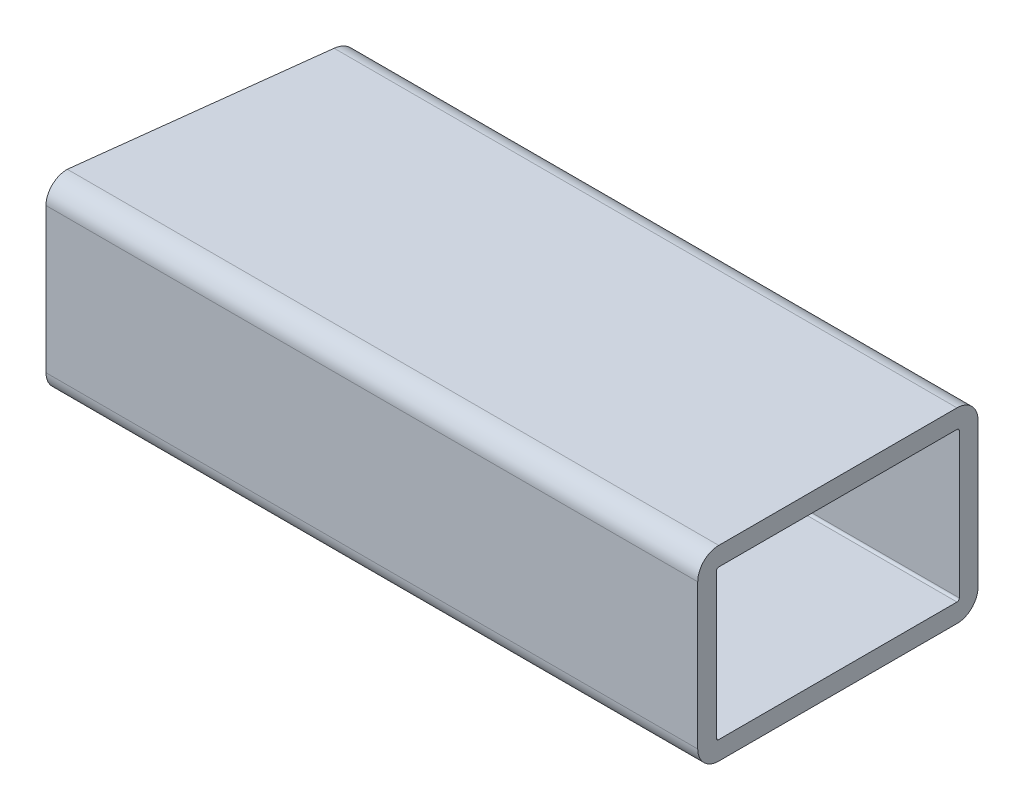
ISO-10303-21;
HEADER;
FILE_DESCRIPTION(('STEP AP214'),'2;1');
FILE_NAME('part.step','',(''),(''),'','','');
FILE_SCHEMA(('AUTOMOTIVE_DESIGN { 1 0 10303 214 1 1 1 1 }'));
ENDSEC;
DATA;
#1=APPLICATION_CONTEXT('core data for automotive mechanical design processes');
#2=APPLICATION_PROTOCOL_DEFINITION('international standard','automotive_design',2000,#1);
#3=PRODUCT_CONTEXT('',#1,'mechanical');
#4=PRODUCT('Part','Part','',(#3));
#5=PRODUCT_RELATED_PRODUCT_CATEGORY('part','',(#4));
#6=PRODUCT_DEFINITION_FORMATION('','',#4);
#7=PRODUCT_DEFINITION_CONTEXT('part definition',#1,'design');
#8=PRODUCT_DEFINITION('design','',#6,#7);
#9=PRODUCT_DEFINITION_SHAPE('','',#8);
#10=(LENGTH_UNIT() NAMED_UNIT(*) SI_UNIT(.MILLI.,.METRE.));
#11=(NAMED_UNIT(*) PLANE_ANGLE_UNIT() SI_UNIT($,.RADIAN.));
#12=(NAMED_UNIT(*) SI_UNIT($,.STERADIAN.) SOLID_ANGLE_UNIT());
#13=UNCERTAINTY_MEASURE_WITH_UNIT(LENGTH_MEASURE(1.E-05),#10,'distance_accuracy_value','');
#14=(GEOMETRIC_REPRESENTATION_CONTEXT(3) GLOBAL_UNCERTAINTY_ASSIGNED_CONTEXT((#13)) GLOBAL_UNIT_ASSIGNED_CONTEXT((#10,
#11,#12)) REPRESENTATION_CONTEXT('',''));
#15=CARTESIAN_POINT('',(0.,0.,0.));
#16=DIRECTION('',(0.,0.,1.));
#17=DIRECTION('',(1.,0.,0.));
#18=AXIS2_PLACEMENT_3D('',#15,#16,#17);
#19=CARTESIAN_POINT('',(0.479999999999985,15.5,26.));
#20=CARTESIAN_POINT('',(0.479999999999998,15.5,27.3333333333333));
#21=CARTESIAN_POINT('',(0.48000000000001,15.5,28.6666666666667));
#22=CARTESIAN_POINT('',(0.480000000000022,15.5,30.));
#23=CARTESIAN_POINT('',(0.479999999999985,14.5,26.));
#24=CARTESIAN_POINT('',(0.479999999999998,11.8333333333333,27.3333333333333));
#25=CARTESIAN_POINT('',(0.48000000000001,9.16666666666668,28.6666666666667));
#26=CARTESIAN_POINT('',(0.480000000000022,6.50000000000001,30.));
#27=CARTESIAN_POINT('',(0.599999999999985,14.5,25.));
#28=CARTESIAN_POINT('',(0.599999999999973,11.8333333333333,23.6666666666667));
#29=CARTESIAN_POINT('',(0.59999999999996,9.16666666666668,22.3333333333333));
#30=CARTESIAN_POINT('',(0.599999999999947,6.50000000000001,21.));
#31=CARTESIAN_POINT('',(0.599999999999985,15.5,25.));
#32=CARTESIAN_POINT('',(0.599999999999972,15.5,23.6666666666667));
#33=CARTESIAN_POINT('',(0.59999999999996,15.5,22.3333333333333));
#34=CARTESIAN_POINT('',(0.599999999999947,15.5,21.));
#35=CARTESIAN_POINT('',(0.599999999999985,16.5,25.));
#36=CARTESIAN_POINT('',(0.599999999999973,19.1666666666667,23.6666666666667));
#37=CARTESIAN_POINT('',(0.59999999999996,21.8333333333333,22.3333333333333));
#38=CARTESIAN_POINT('',(0.599999999999947,24.5,21.));
#39=CARTESIAN_POINT('',(0.479999999999985,16.5,26.));
#40=CARTESIAN_POINT('',(0.479999999999998,19.1666666666667,27.3333333333333));
#41=CARTESIAN_POINT('',(0.48000000000001,21.8333333333333,28.6666666666667));
#42=CARTESIAN_POINT('',(0.480000000000022,24.5,30.));
#43=CARTESIAN_POINT('',(0.479999999999985,15.5,26.));
#44=CARTESIAN_POINT('',(0.479999999999998,15.5,27.3333333333333));
#45=CARTESIAN_POINT('',(0.48000000000001,15.5,28.6666666666667));
#46=CARTESIAN_POINT('',(0.480000000000022,15.5,30.));
#47=(BOUNDED_SURFACE() B_SPLINE_SURFACE(3,3,((#19,#20,#21,#22),(#23,#24,#25,#26),(#27,#28,#29,
#30),(#31,#32,#33,#34),(#35,#36,#37,#38),(#39,#40,#41,#42),(#43,#44,#45,#46)),.UNSPECIFIED.,.T.,
.F.,.F.) B_SPLINE_SURFACE_WITH_KNOTS((4,3,4),(4,4),(0.,0.5,1.),(0.,1.),
.UNSPECIFIED.) GEOMETRIC_REPRESENTATION_ITEM() RATIONAL_B_SPLINE_SURFACE(((1.,1.,1.,1.),
(0.333333333333333,0.333333333333333,0.333333333333333,0.333333333333333),(0.333333333333333,
0.333333333333333,0.333333333333333,0.333333333333333),(1.,1.,1.,1.),(0.333333333333333,
0.333333333333333,0.333333333333333,0.333333333333333),(0.333333333333333,0.333333333333333,
0.333333333333333,0.333333333333333),(1.,1.,1.,1.))) REPRESENTATION_ITEM('') SURFACE());
#48=DIRECTION('',(0.,0.,-1.));
#49=VECTOR('',#48,1.);
#50=CARTESIAN_POINT('',(0.47999999999998,15.5,26.));
#51=LINE('',#50,#49);
#52=CARTESIAN_POINT('',(0.47999999999998,15.5,30.));
#53=VERTEX_POINT('',#52);
#54=CARTESIAN_POINT('',(0.47999999999998,15.5,26.));
#55=VERTEX_POINT('',#54);
#56=EDGE_CURVE('E12',#53,#55,#51,.T.);
#57=CARTESIAN_POINT('',(0.539999999999985,15.5,25.5));
#58=DIRECTION('',(0.999911122961208,0.,0.0133321483061411));
#59=DIRECTION('',(-0.0133321483061411,0.,0.999911122961208));
#60=AXIS2_PLACEMENT_3D('',#57,#58,#59);
#61=ELLIPSE('',#60,4.5003999822238,4.5);
#62=CARTESIAN_POINT('',(0.539999999999985,20.,25.5));
#63=VERTEX_POINT('',#62);
#64=EDGE_CURVE('E310',#63,#53,#61,.T.);
#65=DIRECTION('',(0.,-1.,0.));
#66=VECTOR('',#65,1.);
#67=CARTESIAN_POINT('',(0.53999999999999,16.,25.5));
#68=LINE('',#67,#66);
#69=CARTESIAN_POINT('',(0.53999999999999,16.,25.5));
#70=VERTEX_POINT('',#69);
#71=EDGE_CURVE('E84',#63,#70,#68,.T.);
#72=CARTESIAN_POINT('',(0.539999999999985,15.5,25.5));
#73=DIRECTION('',(0.992876838486922,0.,0.119145220618431));
#74=DIRECTION('',(-0.119145220618431,0.,0.992876838486922));
#75=AXIS2_PLACEMENT_3D('',#72,#73,#74);
#76=ELLIPSE('',#75,0.503587132480565,0.499999999999998);
#77=EDGE_CURVE('E265',#70,#55,#76,.T.);
#78=ORIENTED_EDGE('',*,*,#56,.F.);
#79=ORIENTED_EDGE('',*,*,#64,.F.);
#80=ORIENTED_EDGE('',*,*,#71,.T.);
#81=ORIENTED_EDGE('',*,*,#77,.T.);
#82=EDGE_LOOP('',(#78,#79,#80,#81));
#83=FACE_BOUND('',#82,.T.);
#84=ADVANCED_FACE('F75',(#83),#47,.T.);
#85=CARTESIAN_POINT('',(2.51971608832807,16.,9.00236593059934));
#86=DIRECTION('',(0.992876838486922,0.,0.119145220618431));
#87=DIRECTION('',(-0.119145220618431,0.,0.992876838486922));
#88=AXIS2_PLACEMENT_3D('',#85,#86,#87);
#89=PLANE('',#88);
#90=ORIENTED_EDGE('',*,*,#71,.F.);
#91=DIRECTION('',(-0.119145220618431,0.,0.992876838486922));
#92=VECTOR('',#91,1.);
#93=CARTESIAN_POINT('',(2.51971608832807,20.,9.00236593059934));
#94=LINE('',#93,#92);
#95=CARTESIAN_POINT('',(6.66,20.,-25.5));
#96=VERTEX_POINT('',#95);
#97=EDGE_CURVE('E315',#96,#63,#94,.T.);
#98=ORIENTED_EDGE('',*,*,#97,.F.);
#99=DIRECTION('',(0.,1.,0.));
#100=VECTOR('',#99,1.);
#101=CARTESIAN_POINT('',(6.66000000000001,20.,-25.5));
#102=LINE('',#101,#100);
#103=CARTESIAN_POINT('',(6.66,16.,-25.5));
#104=VERTEX_POINT('',#103);
#105=EDGE_CURVE('E229',#104,#96,#102,.T.);
#106=ORIENTED_EDGE('',*,*,#105,.F.);
#107=DIRECTION('',(-0.119145220618431,0.,0.992876838486922));
#108=VECTOR('',#107,1.);
#109=CARTESIAN_POINT('',(2.51971608832807,16.,9.00236593059934));
#110=LINE('',#109,#108);
#111=EDGE_CURVE('E273',#104,#70,#110,.T.);
#112=ORIENTED_EDGE('',*,*,#111,.T.);
#113=EDGE_LOOP('',(#90,#98,#106,#112));
#114=FACE_BOUND('',#113,.T.);
#115=ADVANCED_FACE('F355',(#114),#89,.F.);
#116=CARTESIAN_POINT('',(8.55283911671925,-16.,-41.2736593059937));
#117=DIRECTION('',(0.992876838486922,0.,0.119145220618431));
#118=DIRECTION('',(0.119145220618431,0.,-0.992876838486922));
#119=AXIS2_PLACEMENT_3D('',#116,#117,#118);
#120=PLANE('',#119);
#121=DIRECTION('',(0.,-1.,0.));
#122=VECTOR('',#121,1.);
#123=CARTESIAN_POINT('',(6.66,-20.,-25.5));
#124=LINE('',#123,#122);
#125=CARTESIAN_POINT('',(6.66,-16.,-25.5));
#126=VERTEX_POINT('',#125);
#127=CARTESIAN_POINT('',(6.66,-20.,-25.5));
#128=VERTEX_POINT('',#127);
#129=EDGE_CURVE('E215',#126,#128,#124,.T.);
#130=ORIENTED_EDGE('',*,*,#129,.T.);
#131=DIRECTION('',(0.119145220618431,0.,-0.992876838486922));
#132=VECTOR('',#131,1.);
#133=CARTESIAN_POINT('',(8.55283911671925,-20.,-41.2736593059937));
#134=LINE('',#133,#132);
#135=CARTESIAN_POINT('',(0.540000000000013,-20.,25.5));
#136=VERTEX_POINT('',#135);
#137=EDGE_CURVE('E191',#136,#128,#134,.T.);
#138=ORIENTED_EDGE('',*,*,#137,.F.);
#139=DIRECTION('',(0.,1.,0.));
#140=VECTOR('',#139,1.);
#141=CARTESIAN_POINT('',(0.540000000000002,-16.,25.5));
#142=LINE('',#141,#140);
#143=CARTESIAN_POINT('',(0.540000000000002,-16.,25.5));
#144=VERTEX_POINT('',#143);
#145=EDGE_CURVE('E343',#136,#144,#142,.T.);
#146=ORIENTED_EDGE('',*,*,#145,.T.);
#147=DIRECTION('',(0.119145220618431,0.,-0.992876838486922));
#148=VECTOR('',#147,1.);
#149=CARTESIAN_POINT('',(8.55283911671925,-16.,-41.2736593059937));
#150=LINE('',#149,#148);
#151=EDGE_CURVE('E218',#144,#126,#150,.T.);
#152=ORIENTED_EDGE('',*,*,#151,.T.);
#153=EDGE_LOOP('',(#130,#138,#146,#152));
#154=FACE_BOUND('',#153,.T.);
#155=ADVANCED_FACE('F216',(#154),#120,.F.);
#156=CARTESIAN_POINT('',(0.479999999999985,-15.5,26.));
#157=CARTESIAN_POINT('',(0.479999999999998,-15.5,27.3333333333333));
#158=CARTESIAN_POINT('',(0.48000000000001,-15.5,28.6666666666667));
#159=CARTESIAN_POINT('',(0.480000000000022,-15.5,30.));
#160=CARTESIAN_POINT('',(0.479999999999985,-16.5,26.));
#161=CARTESIAN_POINT('',(0.479999999999998,-19.1666666666667,27.3333333333333));
#162=CARTESIAN_POINT('',(0.48000000000001,-21.8333333333333,28.6666666666667));
#163=CARTESIAN_POINT('',(0.480000000000022,-24.5,30.));
#164=CARTESIAN_POINT('',(0.599999999999985,-16.5,25.));
#165=CARTESIAN_POINT('',(0.599999999999973,-19.1666666666667,23.6666666666667));
#166=CARTESIAN_POINT('',(0.59999999999996,-21.8333333333333,22.3333333333333));
#167=CARTESIAN_POINT('',(0.599999999999947,-24.5,21.));
#168=CARTESIAN_POINT('',(0.599999999999985,-15.5,25.));
#169=CARTESIAN_POINT('',(0.599999999999972,-15.5,23.6666666666667));
#170=CARTESIAN_POINT('',(0.59999999999996,-15.5,22.3333333333333));
#171=CARTESIAN_POINT('',(0.599999999999947,-15.5,21.));
#172=CARTESIAN_POINT('',(0.599999999999985,-14.5,25.));
#173=CARTESIAN_POINT('',(0.599999999999973,-11.8333333333333,23.6666666666667));
#174=CARTESIAN_POINT('',(0.59999999999996,-9.16666666666668,22.3333333333333));
#175=CARTESIAN_POINT('',(0.599999999999947,-6.50000000000001,21.));
#176=CARTESIAN_POINT('',(0.479999999999985,-14.5,26.));
#177=CARTESIAN_POINT('',(0.479999999999998,-11.8333333333333,27.3333333333333));
#178=CARTESIAN_POINT('',(0.48000000000001,-9.16666666666668,28.6666666666667));
#179=CARTESIAN_POINT('',(0.480000000000022,-6.50000000000001,30.));
#180=CARTESIAN_POINT('',(0.479999999999985,-15.5,26.));
#181=CARTESIAN_POINT('',(0.479999999999998,-15.5,27.3333333333333));
#182=CARTESIAN_POINT('',(0.48000000000001,-15.5,28.6666666666667));
#183=CARTESIAN_POINT('',(0.480000000000022,-15.5,30.));
#184=(BOUNDED_SURFACE() B_SPLINE_SURFACE(3,3,((#156,#157,#158,#159),(#160,#161,#162,#163),(#164,
#165,#166,#167),(#168,#169,#170,#171),(#172,#173,#174,#175),(#176,#177,#178,#179),(#180,#181,
#182,#183)),.UNSPECIFIED.,.T.,.F.,.F.) B_SPLINE_SURFACE_WITH_KNOTS((4,3,4),(4,4),(0.,0.5,1.),
(0.,1.),.UNSPECIFIED.) GEOMETRIC_REPRESENTATION_ITEM() RATIONAL_B_SPLINE_SURFACE(((1.,1.,1.,1.),
(0.333333333333333,0.333333333333333,0.333333333333333,0.333333333333333),(0.333333333333333,
0.333333333333333,0.333333333333333,0.333333333333333),(1.,1.,1.,1.),(0.333333333333333,
0.333333333333333,0.333333333333333,0.333333333333333),(0.333333333333333,0.333333333333333,
0.333333333333333,0.333333333333333),(1.,1.,1.,1.))) REPRESENTATION_ITEM('') SURFACE());
#185=CARTESIAN_POINT('',(0.539999999999985,-15.5,25.5));
#186=DIRECTION('',(0.999911122961208,0.,0.0133321483061411));
#187=DIRECTION('',(-0.0133321483061411,0.,0.999911122961208));
#188=AXIS2_PLACEMENT_3D('',#185,#186,#187);
#189=ELLIPSE('',#188,4.5003999822238,4.5);
#190=CARTESIAN_POINT('',(0.480000000000008,-15.5,30.));
#191=VERTEX_POINT('',#190);
#192=EDGE_CURVE('E222',#191,#136,#189,.T.);
#193=DIRECTION('',(0.,0.,-1.));
#194=VECTOR('',#193,1.);
#195=CARTESIAN_POINT('',(0.480000000000008,-15.5,26.));
#196=LINE('',#195,#194);
#197=CARTESIAN_POINT('',(0.480000000000008,-15.5,26.));
#198=VERTEX_POINT('',#197);
#199=EDGE_CURVE('E79',#191,#198,#196,.T.);
#200=CARTESIAN_POINT('',(0.539999999999985,-15.5,25.5));
#201=DIRECTION('',(0.992876838486922,0.,0.119145220618431));
#202=DIRECTION('',(-0.119145220618431,0.,0.992876838486922));
#203=AXIS2_PLACEMENT_3D('',#200,#201,#202);
#204=ELLIPSE('',#203,0.503587132480565,0.499999999999998);
#205=EDGE_CURVE('E246',#198,#144,#204,.T.);
#206=ORIENTED_EDGE('',*,*,#145,.F.);
#207=ORIENTED_EDGE('',*,*,#192,.F.);
#208=ORIENTED_EDGE('',*,*,#199,.T.);
#209=ORIENTED_EDGE('',*,*,#205,.T.);
#210=EDGE_LOOP('',(#206,#207,#208,#209));
#211=FACE_BOUND('',#210,.T.);
#212=ADVANCED_FACE('F419',(#211),#184,.T.);
#213=CARTESIAN_POINT('',(0.480000000000008,15.5,26.));
#214=DIRECTION('',(1.,0.,0.));
#215=DIRECTION('',(0.,-1.,0.));
#216=AXIS2_PLACEMENT_3D('',#213,#214,#215);
#217=PLANE('',#216);
#218=DIRECTION('',(0.,1.,0.));
#219=VECTOR('',#218,1.);
#220=CARTESIAN_POINT('',(0.47999999999998,15.5,30.));
#221=LINE('',#220,#219);
#222=EDGE_CURVE('E301',#53,#191,#221,.F.);
#223=ORIENTED_EDGE('',*,*,#222,.F.);
#224=ORIENTED_EDGE('',*,*,#56,.T.);
#225=DIRECTION('',(0.,-1.,0.));
#226=VECTOR('',#225,1.);
#227=CARTESIAN_POINT('',(0.480000000000008,15.5,26.));
#228=LINE('',#227,#226);
#229=EDGE_CURVE('E257',#55,#198,#228,.T.);
#230=ORIENTED_EDGE('',*,*,#229,.T.);
#231=ORIENTED_EDGE('',*,*,#199,.F.);
#232=EDGE_LOOP('',(#223,#224,#230,#231));
#233=FACE_BOUND('',#232,.T.);
#234=ADVANCED_FACE('F373',(#233),#217,.F.);
#235=CARTESIAN_POINT('',(140.,-16.,-25.5));
#236=DIRECTION('',(1.,0.,0.));
#237=DIRECTION('',(0.,0.,-1.));
#238=AXIS2_PLACEMENT_3D('',#235,#236,#237);
#239=PLANE('',#238);
#240=DIRECTION('',(0.,0.,-1.));
#241=VECTOR('',#240,1.);
#242=CARTESIAN_POINT('',(140.,-16.,-25.5));
#243=LINE('',#242,#241);
#244=CARTESIAN_POINT('',(140.,-16.,25.5));
#245=VERTEX_POINT('',#244);
#246=CARTESIAN_POINT('',(140.,-16.,-25.5));
#247=VERTEX_POINT('',#246);
#248=EDGE_CURVE('E293',#245,#247,#243,.T.);
#249=ORIENTED_EDGE('',*,*,#248,.F.);
#250=CARTESIAN_POINT('',(140.,-15.5,25.5));
#251=DIRECTION('',(1.,0.,0.));
#252=DIRECTION('',(0.,0.,-1.));
#253=AXIS2_PLACEMENT_3D('',#250,#251,#252);
#254=CIRCLE('',#253,0.499999999999998);
#255=CARTESIAN_POINT('',(140.,-15.5,26.));
#256=VERTEX_POINT('',#255);
#257=EDGE_CURVE('E252',#256,#245,#254,.T.);
#258=ORIENTED_EDGE('',*,*,#257,.F.);
#259=DIRECTION('',(0.,-1.,0.));
#260=VECTOR('',#259,1.);
#261=CARTESIAN_POINT('',(140.,15.5,26.));
#262=LINE('',#261,#260);
#263=CARTESIAN_POINT('',(140.,15.5,26.));
#264=VERTEX_POINT('',#263);
#265=EDGE_CURVE('E263',#264,#256,#262,.T.);
#266=ORIENTED_EDGE('',*,*,#265,.F.);
#267=CARTESIAN_POINT('',(140.,15.5,25.5));
#268=DIRECTION('',(1.,0.,0.));
#269=DIRECTION('',(0.,0.,-1.));
#270=AXIS2_PLACEMENT_3D('',#267,#268,#269);
#271=CIRCLE('',#270,0.499999999999998);
#272=CARTESIAN_POINT('',(140.,16.,25.5));
#273=VERTEX_POINT('',#272);
#274=EDGE_CURVE('E271',#273,#264,#271,.T.);
#275=ORIENTED_EDGE('',*,*,#274,.F.);
#276=DIRECTION('',(0.,0.,1.));
#277=VECTOR('',#276,1.);
#278=CARTESIAN_POINT('',(140.,16.,25.5));
#279=LINE('',#278,#277);
#280=CARTESIAN_POINT('',(140.,16.,-25.5));
#281=VERTEX_POINT('',#280);
#282=EDGE_CURVE('E278',#281,#273,#279,.T.);
#283=ORIENTED_EDGE('',*,*,#282,.F.);
#284=CARTESIAN_POINT('',(140.,15.5,-25.5));
#285=DIRECTION('',(1.,0.,0.));
#286=DIRECTION('',(0.,0.,-1.));
#287=AXIS2_PLACEMENT_3D('',#284,#285,#286);
#288=CIRCLE('',#287,0.499999999999998);
#289=CARTESIAN_POINT('',(140.,15.5,-26.));
#290=VERTEX_POINT('',#289);
#291=EDGE_CURVE('E282',#290,#281,#288,.T.);
#292=ORIENTED_EDGE('',*,*,#291,.F.);
#293=DIRECTION('',(0.,1.,0.));
#294=VECTOR('',#293,1.);
#295=CARTESIAN_POINT('',(140.,-15.5,-26.));
#296=LINE('',#295,#294);
#297=CARTESIAN_POINT('',(140.,-15.5,-26.));
#298=VERTEX_POINT('',#297);
#299=EDGE_CURVE('E286',#298,#290,#296,.T.);
#300=ORIENTED_EDGE('',*,*,#299,.F.);
#301=CARTESIAN_POINT('',(140.,-15.5,-25.5));
#302=DIRECTION('',(1.,0.,0.));
#303=DIRECTION('',(0.,0.,-1.));
#304=AXIS2_PLACEMENT_3D('',#301,#302,#303);
#305=CIRCLE('',#304,0.499999999999998);
#306=EDGE_CURVE('E290',#247,#298,#305,.T.);
#307=ORIENTED_EDGE('',*,*,#306,.F.);
#308=EDGE_LOOP('',(#249,#258,#266,#275,#283,#292,#300,#307));
#309=FACE_BOUND('',#308,.T.);
#310=DIRECTION('',(0.,0.,1.));
#311=VECTOR('',#310,1.);
#312=CARTESIAN_POINT('',(140.,-20.,-25.5));
#313=LINE('',#312,#311);
#314=CARTESIAN_POINT('',(140.,-20.,25.5));
#315=VERTEX_POINT('',#314);
#316=CARTESIAN_POINT('',(140.,-20.,-25.5));
#317=VERTEX_POINT('',#316);
#318=EDGE_CURVE('E201',#315,#317,#313,.F.);
#319=ORIENTED_EDGE('',*,*,#318,.T.);
#320=CARTESIAN_POINT('',(140.,-15.5,-25.5));
#321=DIRECTION('',(-1.,0.,0.));
#322=DIRECTION('',(0.,0.,1.));
#323=AXIS2_PLACEMENT_3D('',#320,#321,#322);
#324=CIRCLE('',#323,4.5);
#325=CARTESIAN_POINT('',(140.,-15.5,-30.));
#326=VERTEX_POINT('',#325);
#327=EDGE_CURVE('E202',#317,#326,#324,.F.);
#328=ORIENTED_EDGE('',*,*,#327,.T.);
#329=DIRECTION('',(0.,1.,0.));
#330=VECTOR('',#329,1.);
#331=CARTESIAN_POINT('',(140.,-15.5,-30.));
#332=LINE('',#331,#330);
#333=CARTESIAN_POINT('',(140.,15.5,-30.));
#334=VERTEX_POINT('',#333);
#335=EDGE_CURVE('E211',#326,#334,#332,.T.);
#336=ORIENTED_EDGE('',*,*,#335,.T.);
#337=CARTESIAN_POINT('',(140.,15.5,-25.5));
#338=DIRECTION('',(-1.,0.,0.));
#339=DIRECTION('',(0.,0.,1.));
#340=AXIS2_PLACEMENT_3D('',#337,#338,#339);
#341=CIRCLE('',#340,4.5);
#342=CARTESIAN_POINT('',(140.,20.,-25.5));
#343=VERTEX_POINT('',#342);
#344=EDGE_CURVE('E319',#334,#343,#341,.F.);
#345=ORIENTED_EDGE('',*,*,#344,.T.);
#346=DIRECTION('',(0.,0.,-1.));
#347=VECTOR('',#346,1.);
#348=CARTESIAN_POINT('',(140.,20.,25.5));
#349=LINE('',#348,#347);
#350=CARTESIAN_POINT('',(140.,20.,25.5));
#351=VERTEX_POINT('',#350);
#352=EDGE_CURVE('E314',#343,#351,#349,.F.);
#353=ORIENTED_EDGE('',*,*,#352,.T.);
#354=CARTESIAN_POINT('',(140.,15.5,25.5));
#355=DIRECTION('',(-1.,0.,0.));
#356=DIRECTION('',(0.,0.,1.));
#357=AXIS2_PLACEMENT_3D('',#354,#355,#356);
#358=CIRCLE('',#357,4.5);
#359=CARTESIAN_POINT('',(140.,15.5,30.));
#360=VERTEX_POINT('',#359);
#361=EDGE_CURVE('E309',#351,#360,#358,.F.);
#362=ORIENTED_EDGE('',*,*,#361,.T.);
#363=DIRECTION('',(0.,1.,0.));
#364=VECTOR('',#363,1.);
#365=CARTESIAN_POINT('',(140.,15.5,30.));
#366=LINE('',#365,#364);
#367=CARTESIAN_POINT('',(140.,-15.5,30.));
#368=VERTEX_POINT('',#367);
#369=EDGE_CURVE('E305',#360,#368,#366,.F.);
#370=ORIENTED_EDGE('',*,*,#369,.T.);
#371=CARTESIAN_POINT('',(140.,-15.5,25.5));
#372=DIRECTION('',(-1.,0.,0.));
#373=DIRECTION('',(0.,0.,1.));
#374=AXIS2_PLACEMENT_3D('',#371,#372,#373);
#375=CIRCLE('',#374,4.5);
#376=EDGE_CURVE('E299',#368,#315,#375,.F.);
#377=ORIENTED_EDGE('',*,*,#376,.T.);
#378=EDGE_LOOP('',(#319,#328,#336,#345,#353,#362,#370,#377));
#379=FACE_BOUND('',#378,.T.);
#380=ADVANCED_FACE('F77',(#309,#379),#239,.T.);
#381=CARTESIAN_POINT('',(140.,-15.5,25.5));
#382=DIRECTION('',(-1.,0.,0.));
#383=DIRECTION('',(0.,0.,1.));
#384=AXIS2_PLACEMENT_3D('',#381,#382,#383);
#385=CYLINDRICAL_SURFACE('',#384,0.499999999999998);
#386=ORIENTED_EDGE('',*,*,#205,.F.);
#387=DIRECTION('',(-1.,0.,0.));
#388=VECTOR('',#387,1.);
#389=CARTESIAN_POINT('',(140.,-15.5,26.));
#390=LINE('',#389,#388);
#391=EDGE_CURVE('E249',#256,#198,#390,.T.);
#392=ORIENTED_EDGE('',*,*,#391,.F.);
#393=ORIENTED_EDGE('',*,*,#257,.T.);
#394=DIRECTION('',(-1.,0.,0.));
#395=VECTOR('',#394,1.);
#396=CARTESIAN_POINT('',(140.,-16.,25.5));
#397=LINE('',#396,#395);
#398=EDGE_CURVE('E254',#245,#144,#397,.T.);
#399=ORIENTED_EDGE('',*,*,#398,.T.);
#400=EDGE_LOOP('',(#386,#392,#393,#399));
#401=FACE_BOUND('',#400,.T.);
#402=ADVANCED_FACE('F424',(#401),#385,.F.);
#403=CARTESIAN_POINT('',(140.,15.5,26.));
#404=DIRECTION('',(0.,0.,-1.));
#405=DIRECTION('',(-1.,0.,0.));
#406=AXIS2_PLACEMENT_3D('',#403,#404,#405);
#407=PLANE('',#406);
#408=ORIENTED_EDGE('',*,*,#229,.F.);
#409=DIRECTION('',(-1.,0.,0.));
#410=VECTOR('',#409,1.);
#411=CARTESIAN_POINT('',(140.,15.5,26.));
#412=LINE('',#411,#410);
#413=EDGE_CURVE('E260',#264,#55,#412,.T.);
#414=ORIENTED_EDGE('',*,*,#413,.F.);
#415=ORIENTED_EDGE('',*,*,#265,.T.);
#416=ORIENTED_EDGE('',*,*,#391,.T.);
#417=EDGE_LOOP('',(#408,#414,#415,#416));
#418=FACE_BOUND('',#417,.T.);
#419=ADVANCED_FACE('F370',(#418),#407,.T.);
#420=CARTESIAN_POINT('',(140.,15.5,25.5));
#421=DIRECTION('',(-1.,0.,0.));
#422=DIRECTION('',(0.,0.,1.));
#423=AXIS2_PLACEMENT_3D('',#420,#421,#422);
#424=CYLINDRICAL_SURFACE('',#423,0.499999999999998);
#425=ORIENTED_EDGE('',*,*,#77,.F.);
#426=DIRECTION('',(-1.,0.,0.));
#427=VECTOR('',#426,1.);
#428=CARTESIAN_POINT('',(140.,16.,25.5));
#429=LINE('',#428,#427);
#430=EDGE_CURVE('E268',#273,#70,#429,.T.);
#431=ORIENTED_EDGE('',*,*,#430,.F.);
#432=ORIENTED_EDGE('',*,*,#274,.T.);
#433=ORIENTED_EDGE('',*,*,#413,.T.);
#434=EDGE_LOOP('',(#425,#431,#432,#433));
#435=FACE_BOUND('',#434,.T.);
#436=ADVANCED_FACE('F352',(#435),#424,.F.);
#437=CARTESIAN_POINT('',(140.,16.,25.5));
#438=DIRECTION('',(0.,-1.,0.));
#439=DIRECTION('',(0.,0.,-1.));
#440=AXIS2_PLACEMENT_3D('',#437,#438,#439);
#441=PLANE('',#440);
#442=ORIENTED_EDGE('',*,*,#111,.F.);
#443=DIRECTION('',(-1.,0.,0.));
#444=VECTOR('',#443,1.);
#445=CARTESIAN_POINT('',(140.,16.,-25.5));
#446=LINE('',#445,#444);
#447=EDGE_CURVE('E276',#281,#104,#446,.T.);
#448=ORIENTED_EDGE('',*,*,#447,.F.);
#449=ORIENTED_EDGE('',*,*,#282,.T.);
#450=ORIENTED_EDGE('',*,*,#430,.T.);
#451=EDGE_LOOP('',(#442,#448,#449,#450));
#452=FACE_BOUND('',#451,.T.);
#453=ADVANCED_FACE('F358',(#452),#441,.T.);
#454=CARTESIAN_POINT('',(140.,15.5,-25.5));
#455=DIRECTION('',(-1.,0.,0.));
#456=DIRECTION('',(0.,0.,1.));
#457=AXIS2_PLACEMENT_3D('',#454,#455,#456);
#458=CYLINDRICAL_SURFACE('',#457,0.499999999999998);
#459=ORIENTED_EDGE('',*,*,#447,.T.);
#460=CARTESIAN_POINT('',(6.66,15.5,-25.5));
#461=DIRECTION('',(0.679408031498298,0.,0.733760674018176));
#462=DIRECTION('',(-0.733760674018176,0.,0.679408031498298));
#463=AXIS2_PLACEMENT_3D('',#460,#461,#462);
#464=ELLIPSE('',#463,0.735934779718972,0.5);
#465=CARTESIAN_POINT('',(7.20000000000001,15.5,-26.));
#466=VERTEX_POINT('',#465);
#467=EDGE_CURVE('E91',#466,#104,#464,.T.);
#468=ORIENTED_EDGE('',*,*,#467,.F.);
#469=DIRECTION('',(-1.,0.,0.));
#470=VECTOR('',#469,1.);
#471=CARTESIAN_POINT('',(140.,15.5,-26.));
#472=LINE('',#471,#470);
#473=EDGE_CURVE('E280',#290,#466,#472,.T.);
#474=ORIENTED_EDGE('',*,*,#473,.F.);
#475=ORIENTED_EDGE('',*,*,#291,.T.);
#476=EDGE_LOOP('',(#459,#468,#474,#475));
#477=FACE_BOUND('',#476,.T.);
#478=ADVANCED_FACE('F395',(#477),#458,.F.);
#479=CARTESIAN_POINT('',(140.,-15.5,-26.));
#480=DIRECTION('',(0.,0.,1.));
#481=DIRECTION('',(1.,0.,0.));
#482=AXIS2_PLACEMENT_3D('',#479,#480,#481);
#483=PLANE('',#482);
#484=ORIENTED_EDGE('',*,*,#473,.T.);
#485=DIRECTION('',(0.,1.,0.));
#486=VECTOR('',#485,1.);
#487=CARTESIAN_POINT('',(7.20000000000001,-15.5,-26.));
#488=LINE('',#487,#486);
#489=CARTESIAN_POINT('',(7.20000000000001,-15.5,-26.));
#490=VERTEX_POINT('',#489);
#491=EDGE_CURVE('E98',#490,#466,#488,.T.);
#492=ORIENTED_EDGE('',*,*,#491,.F.);
#493=DIRECTION('',(-1.,0.,0.));
#494=VECTOR('',#493,1.);
#495=CARTESIAN_POINT('',(140.,-15.5,-26.));
#496=LINE('',#495,#494);
#497=EDGE_CURVE('E284',#298,#490,#496,.T.);
#498=ORIENTED_EDGE('',*,*,#497,.F.);
#499=ORIENTED_EDGE('',*,*,#299,.T.);
#500=EDGE_LOOP('',(#484,#492,#498,#499));
#501=FACE_BOUND('',#500,.T.);
#502=ADVANCED_FACE('F394',(#501),#483,.T.);
#503=CARTESIAN_POINT('',(140.,-15.5,-25.5));
#504=DIRECTION('',(-1.,0.,0.));
#505=DIRECTION('',(0.,0.,1.));
#506=AXIS2_PLACEMENT_3D('',#503,#504,#505);
#507=CYLINDRICAL_SURFACE('',#506,0.499999999999998);
#508=ORIENTED_EDGE('',*,*,#497,.T.);
#509=CARTESIAN_POINT('',(6.66,-15.5,-25.5));
#510=DIRECTION('',(0.679408031498298,0.,0.733760674018176));
#511=DIRECTION('',(-0.733760674018176,0.,0.679408031498298));
#512=AXIS2_PLACEMENT_3D('',#509,#510,#511);
#513=ELLIPSE('',#512,0.735934779718972,0.5);
#514=EDGE_CURVE('E241',#126,#490,#513,.T.);
#515=ORIENTED_EDGE('',*,*,#514,.F.);
#516=DIRECTION('',(-1.,0.,0.));
#517=VECTOR('',#516,1.);
#518=CARTESIAN_POINT('',(140.,-16.,-25.5));
#519=LINE('',#518,#517);
#520=EDGE_CURVE('E288',#247,#126,#519,.T.);
#521=ORIENTED_EDGE('',*,*,#520,.F.);
#522=ORIENTED_EDGE('',*,*,#306,.T.);
#523=EDGE_LOOP('',(#508,#515,#521,#522));
#524=FACE_BOUND('',#523,.T.);
#525=ADVANCED_FACE('F392',(#524),#507,.F.);
#526=CARTESIAN_POINT('',(140.,-16.,-25.5));
#527=DIRECTION('',(0.,1.,0.));
#528=DIRECTION('',(0.,0.,1.));
#529=AXIS2_PLACEMENT_3D('',#526,#527,#528);
#530=PLANE('',#529);
#531=ORIENTED_EDGE('',*,*,#151,.F.);
#532=ORIENTED_EDGE('',*,*,#398,.F.);
#533=ORIENTED_EDGE('',*,*,#248,.T.);
#534=ORIENTED_EDGE('',*,*,#520,.T.);
#535=EDGE_LOOP('',(#531,#532,#533,#534));
#536=FACE_BOUND('',#535,.T.);
#537=ADVANCED_FACE('F459',(#536),#530,.T.);
#538=CARTESIAN_POINT('',(140.,-15.5,25.5));
#539=DIRECTION('',(-1.,0.,0.));
#540=DIRECTION('',(0.,0.,1.));
#541=AXIS2_PLACEMENT_3D('',#538,#539,#540);
#542=CYLINDRICAL_SURFACE('',#541,4.5);
#543=ORIENTED_EDGE('',*,*,#192,.T.);
#544=DIRECTION('',(-1.,0.,0.));
#545=VECTOR('',#544,1.);
#546=CARTESIAN_POINT('',(140.,-20.,25.5));
#547=LINE('',#546,#545);
#548=EDGE_CURVE('E197',#315,#136,#547,.T.);
#549=ORIENTED_EDGE('',*,*,#548,.F.);
#550=ORIENTED_EDGE('',*,*,#376,.F.);
#551=DIRECTION('',(-1.,0.,0.));
#552=VECTOR('',#551,1.);
#553=CARTESIAN_POINT('',(140.,-15.5,30.));
#554=LINE('',#553,#552);
#555=EDGE_CURVE('E296',#368,#191,#554,.T.);
#556=ORIENTED_EDGE('',*,*,#555,.T.);
#557=EDGE_LOOP('',(#543,#549,#550,#556));
#558=FACE_BOUND('',#557,.T.);
#559=ADVANCED_FACE('F456',(#558),#542,.T.);
#560=CARTESIAN_POINT('',(140.,15.5,30.));
#561=DIRECTION('',(0.,0.,-1.));
#562=DIRECTION('',(-1.,0.,0.));
#563=AXIS2_PLACEMENT_3D('',#560,#561,#562);
#564=PLANE('',#563);
#565=ORIENTED_EDGE('',*,*,#222,.T.);
#566=ORIENTED_EDGE('',*,*,#555,.F.);
#567=ORIENTED_EDGE('',*,*,#369,.F.);
#568=DIRECTION('',(-1.,0.,0.));
#569=VECTOR('',#568,1.);
#570=CARTESIAN_POINT('',(140.,15.5,30.));
#571=LINE('',#570,#569);
#572=EDGE_CURVE('E302',#360,#53,#571,.T.);
#573=ORIENTED_EDGE('',*,*,#572,.T.);
#574=EDGE_LOOP('',(#565,#566,#567,#573));
#575=FACE_BOUND('',#574,.T.);
#576=ADVANCED_FACE('F376',(#575),#564,.F.);
#577=CARTESIAN_POINT('',(140.,15.5,25.5));
#578=DIRECTION('',(-1.,0.,0.));
#579=DIRECTION('',(0.,0.,1.));
#580=AXIS2_PLACEMENT_3D('',#577,#578,#579);
#581=CYLINDRICAL_SURFACE('',#580,4.5);
#582=ORIENTED_EDGE('',*,*,#64,.T.);
#583=ORIENTED_EDGE('',*,*,#572,.F.);
#584=ORIENTED_EDGE('',*,*,#361,.F.);
#585=DIRECTION('',(1.,0.,0.));
#586=VECTOR('',#585,1.);
#587=CARTESIAN_POINT('',(140.,20.,25.5));
#588=LINE('',#587,#586);
#589=EDGE_CURVE('E306',#351,#63,#588,.F.);
#590=ORIENTED_EDGE('',*,*,#589,.T.);
#591=EDGE_LOOP('',(#582,#583,#584,#590));
#592=FACE_BOUND('',#591,.T.);
#593=ADVANCED_FACE('F380',(#592),#581,.T.);
#594=CARTESIAN_POINT('',(140.,20.,25.5));
#595=DIRECTION('',(0.,-1.,0.));
#596=DIRECTION('',(0.,0.,-1.));
#597=AXIS2_PLACEMENT_3D('',#594,#595,#596);
#598=PLANE('',#597);
#599=ORIENTED_EDGE('',*,*,#97,.T.);
#600=ORIENTED_EDGE('',*,*,#589,.F.);
#601=ORIENTED_EDGE('',*,*,#352,.F.);
#602=DIRECTION('',(-1.,0.,0.));
#603=VECTOR('',#602,1.);
#604=CARTESIAN_POINT('',(140.,20.,-25.5));
#605=LINE('',#604,#603);
#606=EDGE_CURVE('E311',#343,#96,#605,.T.);
#607=ORIENTED_EDGE('',*,*,#606,.T.);
#608=EDGE_LOOP('',(#599,#600,#601,#607));
#609=FACE_BOUND('',#608,.T.);
#610=ADVANCED_FACE('F383',(#609),#598,.F.);
#611=CARTESIAN_POINT('',(140.,15.5,-25.5));
#612=DIRECTION('',(-1.,0.,0.));
#613=DIRECTION('',(0.,0.,1.));
#614=AXIS2_PLACEMENT_3D('',#611,#612,#613);
#615=CYLINDRICAL_SURFACE('',#614,4.5);
#616=CARTESIAN_POINT('',(6.66,15.5,-25.5));
#617=DIRECTION('',(0.992876838486922,0.,0.119145220618431));
#618=DIRECTION('',(-0.119145220618431,0.,0.992876838486922));
#619=AXIS2_PLACEMENT_3D('',#616,#617,#618);
#620=ELLIPSE('',#619,4.5322841923251,4.5);
#621=CARTESIAN_POINT('',(7.20000000000001,15.5,-30.));
#622=VERTEX_POINT('',#621);
#623=EDGE_CURVE('E235',#622,#96,#620,.T.);
#624=ORIENTED_EDGE('',*,*,#623,.T.);
#625=ORIENTED_EDGE('',*,*,#606,.F.);
#626=ORIENTED_EDGE('',*,*,#344,.F.);
#627=DIRECTION('',(1.,0.,0.));
#628=VECTOR('',#627,1.);
#629=CARTESIAN_POINT('',(140.,15.5,-30.));
#630=LINE('',#629,#628);
#631=EDGE_CURVE('E316',#334,#622,#630,.F.);
#632=ORIENTED_EDGE('',*,*,#631,.T.);
#633=EDGE_LOOP('',(#624,#625,#626,#632));
#634=FACE_BOUND('',#633,.T.);
#635=ADVANCED_FACE('F445',(#634),#615,.T.);
#636=CARTESIAN_POINT('',(140.,-15.5,-30.));
#637=DIRECTION('',(0.,0.,1.));
#638=DIRECTION('',(1.,0.,0.));
#639=AXIS2_PLACEMENT_3D('',#636,#637,#638);
#640=PLANE('',#639);
#641=DIRECTION('',(0.,1.,0.));
#642=VECTOR('',#641,1.);
#643=CARTESIAN_POINT('',(7.20000000000001,-20.,-30.));
#644=LINE('',#643,#642);
#645=CARTESIAN_POINT('',(7.20000000000001,-15.5,-30.));
#646=VERTEX_POINT('',#645);
#647=EDGE_CURVE('E230',#646,#622,#644,.T.);
#648=ORIENTED_EDGE('',*,*,#647,.T.);
#649=ORIENTED_EDGE('',*,*,#631,.F.);
#650=ORIENTED_EDGE('',*,*,#335,.F.);
#651=DIRECTION('',(-1.,0.,0.));
#652=VECTOR('',#651,1.);
#653=CARTESIAN_POINT('',(140.,-15.5,-30.));
#654=LINE('',#653,#652);
#655=EDGE_CURVE('E320',#326,#646,#654,.T.);
#656=ORIENTED_EDGE('',*,*,#655,.T.);
#657=EDGE_LOOP('',(#648,#649,#650,#656));
#658=FACE_BOUND('',#657,.T.);
#659=ADVANCED_FACE('F442',(#658),#640,.F.);
#660=CARTESIAN_POINT('',(140.,-15.5,-25.5));
#661=DIRECTION('',(-1.,0.,0.));
#662=DIRECTION('',(0.,0.,1.));
#663=AXIS2_PLACEMENT_3D('',#660,#661,#662);
#664=CYLINDRICAL_SURFACE('',#663,4.5);
#665=CARTESIAN_POINT('',(6.66,-15.5,-25.5));
#666=DIRECTION('',(0.992876838486922,0.,0.119145220618431));
#667=DIRECTION('',(-0.119145220618431,0.,0.992876838486922));
#668=AXIS2_PLACEMENT_3D('',#665,#666,#667);
#669=ELLIPSE('',#668,4.5322841923251,4.5);
#670=EDGE_CURVE('E207',#128,#646,#669,.T.);
#671=ORIENTED_EDGE('',*,*,#670,.T.);
#672=ORIENTED_EDGE('',*,*,#655,.F.);
#673=ORIENTED_EDGE('',*,*,#327,.F.);
#674=DIRECTION('',(1.,0.,0.));
#675=VECTOR('',#674,1.);
#676=CARTESIAN_POINT('',(140.,-20.,-25.5));
#677=LINE('',#676,#675);
#678=EDGE_CURVE('E195',#317,#128,#677,.F.);
#679=ORIENTED_EDGE('',*,*,#678,.T.);
#680=EDGE_LOOP('',(#671,#672,#673,#679));
#681=FACE_BOUND('',#680,.T.);
#682=ADVANCED_FACE('F205',(#681),#664,.T.);
#683=CARTESIAN_POINT('',(140.,-20.,-25.5));
#684=DIRECTION('',(0.,1.,0.));
#685=DIRECTION('',(0.,0.,1.));
#686=AXIS2_PLACEMENT_3D('',#683,#684,#685);
#687=PLANE('',#686);
#688=ORIENTED_EDGE('',*,*,#137,.T.);
#689=ORIENTED_EDGE('',*,*,#678,.F.);
#690=ORIENTED_EDGE('',*,*,#318,.F.);
#691=ORIENTED_EDGE('',*,*,#548,.T.);
#692=EDGE_LOOP('',(#688,#689,#690,#691));
#693=FACE_BOUND('',#692,.T.);
#694=ADVANCED_FACE('F193',(#693),#687,.F.);
#695=CARTESIAN_POINT('',(6.11999999999999,-15.5,-25.));
#696=CARTESIAN_POINT('',(6.11999999999999,-15.5,-23.6666666666667));
#697=CARTESIAN_POINT('',(6.12,-15.5,-22.3333333333333));
#698=CARTESIAN_POINT('',(6.12,-15.5,-21.));
#699=CARTESIAN_POINT('',(6.11999999999999,-16.5,-25.));
#700=CARTESIAN_POINT('',(6.11999999999999,-19.1666666666667,-23.6666666666667));
#701=CARTESIAN_POINT('',(6.12,-21.8333333333333,-22.3333333333333));
#702=CARTESIAN_POINT('',(6.12,-24.5,-21.));
#703=CARTESIAN_POINT('',(7.20000000000001,-16.5,-26.));
#704=CARTESIAN_POINT('',(7.20000000000001,-19.1666666666667,-27.3333333333333));
#705=CARTESIAN_POINT('',(7.2,-21.8333333333333,-28.6666666666667));
#706=CARTESIAN_POINT('',(7.2,-24.5,-30.));
#707=CARTESIAN_POINT('',(7.20000000000001,-15.5,-26.));
#708=CARTESIAN_POINT('',(7.20000000000001,-15.5,-27.3333333333333));
#709=CARTESIAN_POINT('',(7.2,-15.5,-28.6666666666667));
#710=CARTESIAN_POINT('',(7.2,-15.5,-30.));
#711=CARTESIAN_POINT('',(7.20000000000001,-14.5,-26.));
#712=CARTESIAN_POINT('',(7.20000000000001,-11.8333333333333,-27.3333333333333));
#713=CARTESIAN_POINT('',(7.2,-9.16666666666667,-28.6666666666667));
#714=CARTESIAN_POINT('',(7.2,-6.5,-30.));
#715=CARTESIAN_POINT('',(6.11999999999999,-14.5,-25.));
#716=CARTESIAN_POINT('',(6.11999999999999,-11.8333333333333,-23.6666666666667));
#717=CARTESIAN_POINT('',(6.12,-9.16666666666667,-22.3333333333333));
#718=CARTESIAN_POINT('',(6.12,-6.5,-21.));
#719=CARTESIAN_POINT('',(6.11999999999999,-15.5,-25.));
#720=CARTESIAN_POINT('',(6.11999999999999,-15.5,-23.6666666666667));
#721=CARTESIAN_POINT('',(6.12,-15.5,-22.3333333333333));
#722=CARTESIAN_POINT('',(6.12,-15.5,-21.));
#723=(BOUNDED_SURFACE() B_SPLINE_SURFACE(3,3,((#695,#696,#697,#698),(#699,#700,#701,#702),(#703,
#704,#705,#706),(#707,#708,#709,#710),(#711,#712,#713,#714),(#715,#716,#717,#718),(#719,#720,
#721,#722)),.UNSPECIFIED.,.T.,.F.,.F.) B_SPLINE_SURFACE_WITH_KNOTS((4,3,4),(4,4),(0.,0.5,1.),
(0.,1.),.UNSPECIFIED.) GEOMETRIC_REPRESENTATION_ITEM() RATIONAL_B_SPLINE_SURFACE(((1.,1.,1.,1.),
(0.333333333333333,0.333333333333333,0.333333333333333,0.333333333333333),(0.333333333333333,
0.333333333333333,0.333333333333333,0.333333333333333),(1.,1.,1.,1.),(0.333333333333333,
0.333333333333333,0.333333333333333,0.333333333333333),(0.333333333333333,0.333333333333333,
0.333333333333333,0.333333333333333),(1.,1.,1.,1.))) REPRESENTATION_ITEM('') SURFACE());
#724=DIRECTION('',(0.,0.,-1.));
#725=VECTOR('',#724,1.);
#726=CARTESIAN_POINT('',(7.20000000000001,-15.5,-30.));
#727=LINE('',#726,#725);
#728=EDGE_CURVE('E223',#490,#646,#727,.T.);
#729=ORIENTED_EDGE('',*,*,#129,.F.);
#730=ORIENTED_EDGE('',*,*,#514,.T.);
#731=ORIENTED_EDGE('',*,*,#728,.T.);
#732=ORIENTED_EDGE('',*,*,#670,.F.);
#733=EDGE_LOOP('',(#729,#730,#731,#732));
#734=FACE_BOUND('',#733,.T.);
#735=ADVANCED_FACE('F226',(#734),#723,.T.);
#736=CARTESIAN_POINT('',(7.20000000000001,-20.,-30.));
#737=DIRECTION('',(1.,0.,0.));
#738=DIRECTION('',(0.,1.,0.));
#739=AXIS2_PLACEMENT_3D('',#736,#737,#738);
#740=PLANE('',#739);
#741=ORIENTED_EDGE('',*,*,#728,.F.);
#742=ORIENTED_EDGE('',*,*,#491,.T.);
#743=DIRECTION('',(0.,0.,-1.));
#744=VECTOR('',#743,1.);
#745=CARTESIAN_POINT('',(7.2,15.5,-30.));
#746=LINE('',#745,#744);
#747=EDGE_CURVE('E233',#466,#622,#746,.T.);
#748=ORIENTED_EDGE('',*,*,#747,.T.);
#749=ORIENTED_EDGE('',*,*,#647,.F.);
#750=EDGE_LOOP('',(#741,#742,#748,#749));
#751=FACE_BOUND('',#750,.T.);
#752=ADVANCED_FACE('F389',(#751),#740,.F.);
#753=CARTESIAN_POINT('',(6.11999999999999,15.5,-25.));
#754=CARTESIAN_POINT('',(6.11999999999999,15.5,-23.6666666666667));
#755=CARTESIAN_POINT('',(6.12,15.5,-22.3333333333333));
#756=CARTESIAN_POINT('',(6.12,15.5,-21.));
#757=CARTESIAN_POINT('',(6.11999999999999,14.5,-25.));
#758=CARTESIAN_POINT('',(6.11999999999999,11.8333333333333,-23.6666666666667));
#759=CARTESIAN_POINT('',(6.12,9.16666666666667,-22.3333333333333));
#760=CARTESIAN_POINT('',(6.12,6.5,-21.));
#761=CARTESIAN_POINT('',(7.20000000000001,14.5,-26.));
#762=CARTESIAN_POINT('',(7.20000000000001,11.8333333333333,-27.3333333333333));
#763=CARTESIAN_POINT('',(7.2,9.16666666666667,-28.6666666666667));
#764=CARTESIAN_POINT('',(7.2,6.5,-30.));
#765=CARTESIAN_POINT('',(7.20000000000001,15.5,-26.));
#766=CARTESIAN_POINT('',(7.20000000000001,15.5,-27.3333333333333));
#767=CARTESIAN_POINT('',(7.2,15.5,-28.6666666666667));
#768=CARTESIAN_POINT('',(7.2,15.5,-30.));
#769=CARTESIAN_POINT('',(7.20000000000001,16.5,-26.));
#770=CARTESIAN_POINT('',(7.20000000000001,19.1666666666667,-27.3333333333333));
#771=CARTESIAN_POINT('',(7.2,21.8333333333333,-28.6666666666667));
#772=CARTESIAN_POINT('',(7.2,24.5,-30.));
#773=CARTESIAN_POINT('',(6.11999999999999,16.5,-25.));
#774=CARTESIAN_POINT('',(6.11999999999999,19.1666666666667,-23.6666666666667));
#775=CARTESIAN_POINT('',(6.12,21.8333333333333,-22.3333333333333));
#776=CARTESIAN_POINT('',(6.12,24.5,-21.));
#777=CARTESIAN_POINT('',(6.11999999999999,15.5,-25.));
#778=CARTESIAN_POINT('',(6.11999999999999,15.5,-23.6666666666667));
#779=CARTESIAN_POINT('',(6.12,15.5,-22.3333333333333));
#780=CARTESIAN_POINT('',(6.12,15.5,-21.));
#781=(BOUNDED_SURFACE() B_SPLINE_SURFACE(3,3,((#753,#754,#755,#756),(#757,#758,#759,#760),(#761,
#762,#763,#764),(#765,#766,#767,#768),(#769,#770,#771,#772),(#773,#774,#775,#776),(#777,#778,
#779,#780)),.UNSPECIFIED.,.T.,.F.,.F.) B_SPLINE_SURFACE_WITH_KNOTS((4,3,4),(4,4),(0.,0.5,1.),
(0.,1.),.UNSPECIFIED.) GEOMETRIC_REPRESENTATION_ITEM() RATIONAL_B_SPLINE_SURFACE(((1.,1.,1.,1.),
(0.333333333333333,0.333333333333333,0.333333333333333,0.333333333333333),(0.333333333333333,
0.333333333333333,0.333333333333333,0.333333333333333),(1.,1.,1.,1.),(0.333333333333333,
0.333333333333333,0.333333333333333,0.333333333333333),(0.333333333333333,0.333333333333333,
0.333333333333333,0.333333333333333),(1.,1.,1.,1.))) REPRESENTATION_ITEM('') SURFACE());
#782=ORIENTED_EDGE('',*,*,#747,.F.);
#783=ORIENTED_EDGE('',*,*,#467,.T.);
#784=ORIENTED_EDGE('',*,*,#105,.T.);
#785=ORIENTED_EDGE('',*,*,#623,.F.);
#786=EDGE_LOOP('',(#782,#783,#784,#785));
#787=FACE_BOUND('',#786,.T.);
#788=ADVANCED_FACE('F387',(#787),#781,.T.);
#789=CLOSED_SHELL('',(#84,#115,#155,#212,#234,#380,#402,#419,#436,#453,#478,#502,#525,#537,#559,
#576,#593,#610,#635,#659,#682,#694,#735,#752,#788));
#790=MANIFOLD_SOLID_BREP('B2',#789);
#791=ADVANCED_BREP_SHAPE_REPRESENTATION('',(#18,#790),#14);
#792=SHAPE_DEFINITION_REPRESENTATION(#9,#791);
ENDSEC;
END-ISO-10303-21;
